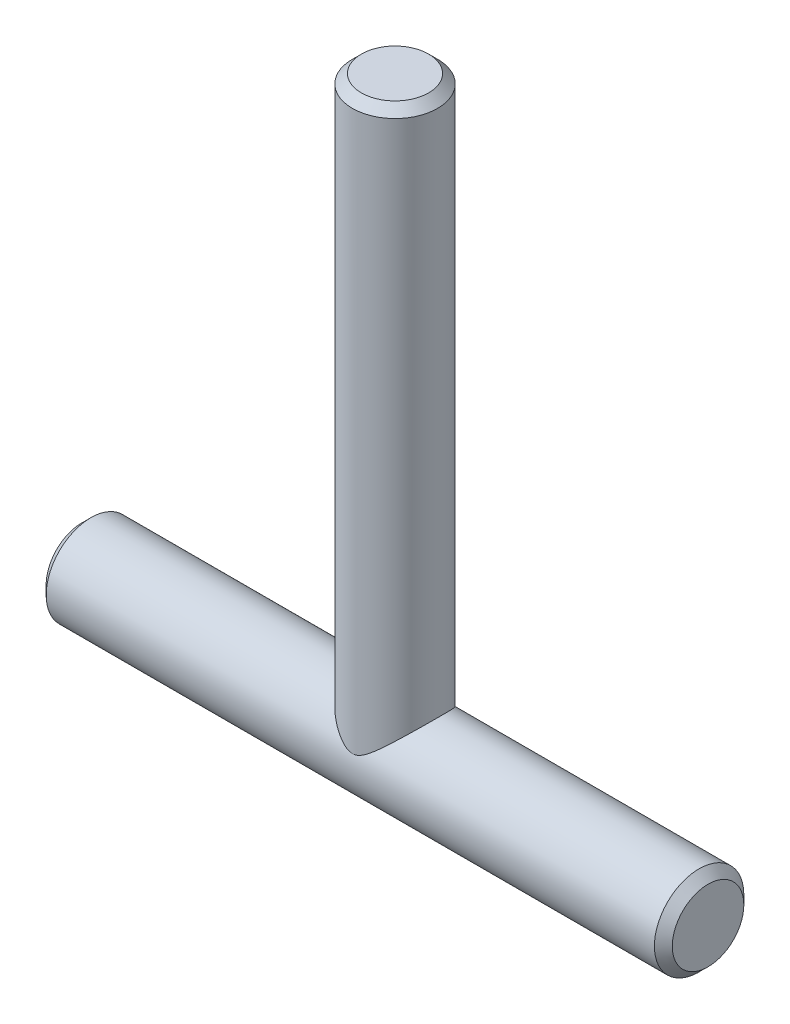
ISO-10303-21;
HEADER;
FILE_DESCRIPTION(('STEP AP214'),'2;1');
FILE_NAME('part.step','',(''),(''),'','','');
FILE_SCHEMA(('AUTOMOTIVE_DESIGN { 1 0 10303 214 1 1 1 1 }'));
ENDSEC;
DATA;
#1=APPLICATION_CONTEXT('core data for automotive mechanical design processes');
#2=APPLICATION_PROTOCOL_DEFINITION('international standard','automotive_design',2000,#1);
#3=PRODUCT_CONTEXT('',#1,'mechanical');
#4=PRODUCT('Part','Part','',(#3));
#5=PRODUCT_RELATED_PRODUCT_CATEGORY('part','',(#4));
#6=PRODUCT_DEFINITION_FORMATION('','',#4);
#7=PRODUCT_DEFINITION_CONTEXT('part definition',#1,'design');
#8=PRODUCT_DEFINITION('design','',#6,#7);
#9=PRODUCT_DEFINITION_SHAPE('','',#8);
#10=(LENGTH_UNIT() NAMED_UNIT(*) SI_UNIT(.MILLI.,.METRE.));
#11=(NAMED_UNIT(*) PLANE_ANGLE_UNIT() SI_UNIT($,.RADIAN.));
#12=(NAMED_UNIT(*) SI_UNIT($,.STERADIAN.) SOLID_ANGLE_UNIT());
#13=UNCERTAINTY_MEASURE_WITH_UNIT(LENGTH_MEASURE(1.E-05),#10,'distance_accuracy_value','');
#14=(GEOMETRIC_REPRESENTATION_CONTEXT(3) GLOBAL_UNCERTAINTY_ASSIGNED_CONTEXT((#13)) GLOBAL_UNIT_ASSIGNED_CONTEXT((#10,
#11,#12)) REPRESENTATION_CONTEXT('',''));
#15=CARTESIAN_POINT('',(0.,0.,0.));
#16=DIRECTION('',(0.,0.,1.));
#17=DIRECTION('',(1.,0.,0.));
#18=AXIS2_PLACEMENT_3D('',#15,#16,#17);
#19=CARTESIAN_POINT('',(35.,-5.,0.));
#20=DIRECTION('',(-1.,0.,0.));
#21=DIRECTION('',(0.,0.,1.));
#22=AXIS2_PLACEMENT_3D('',#19,#20,#21);
#23=CYLINDRICAL_SURFACE('',#22,5.);
#24=CARTESIAN_POINT('',(34.,-5.,0.));
#25=DIRECTION('',(1.,0.,0.));
#26=DIRECTION('',(0.,0.,-1.));
#27=AXIS2_PLACEMENT_3D('',#24,#25,#26);
#28=CIRCLE('',#27,5.);
#29=CARTESIAN_POINT('',(34.,-5.,-5.));
#30=VERTEX_POINT('',#29);
#31=EDGE_CURVE('E68',#30,#30,#28,.F.);
#32=ORIENTED_EDGE('',*,*,#31,.T.);
#33=EDGE_LOOP('',(#32));
#34=FACE_BOUND('',#33,.T.);
#35=CARTESIAN_POINT('',(-34.,-5.,0.));
#36=DIRECTION('',(1.,0.,0.));
#37=DIRECTION('',(0.,0.,-1.));
#38=AXIS2_PLACEMENT_3D('',#35,#36,#37);
#39=CIRCLE('',#38,5.);
#40=CARTESIAN_POINT('',(-34.,-5.,-5.));
#41=VERTEX_POINT('',#40);
#42=EDGE_CURVE('E74',#41,#41,#39,.T.);
#43=ORIENTED_EDGE('',*,*,#42,.T.);
#44=EDGE_LOOP('',(#43));
#45=FACE_BOUND('',#44,.T.);
#46=CARTESIAN_POINT('',(0.,-3.47730707297893,4.7625));
#47=CARTESIAN_POINT('',(-0.0962723355496803,-3.47726271930927,4.76249115843637));
#48=CARTESIAN_POINT('',(-0.192695930536659,-3.4679354693983,4.75953460625216));
#49=CARTESIAN_POINT('',(-0.382304249416825,-3.43287127327197,4.74809394696032));
#50=CARTESIAN_POINT('',(-0.47547324676432,-3.40706387148736,4.73958610368162));
#51=CARTESIAN_POINT('',(-0.639502705541242,-3.34990005725682,4.71994664895306));
#52=CARTESIAN_POINT('',(-0.711205209151666,-3.32056799197743,4.70963531957634));
#53=CARTESIAN_POINT('',(-0.851682658356092,-3.25642258319885,4.68626838956459));
#54=CARTESIAN_POINT('',(-0.920454970229299,-3.22160443543437,4.67321038022113));
#55=CARTESIAN_POINT('',(-1.12328700407057,-3.11126030730019,4.6302095016862));
#56=CARTESIAN_POINT('',(-1.25340485219234,-3.03002788058553,4.59649833090679));
#57=CARTESIAN_POINT('',(-1.52778509316713,-2.84575625192604,4.51344814983352));
#58=CARTESIAN_POINT('',(-1.67058833257177,-2.74137811152718,4.46241294947431));
#59=CARTESIAN_POINT('',(-1.94845826940471,-2.52873039907888,4.3482695784667));
#60=CARTESIAN_POINT('',(-2.08351667436905,-2.42045685077803,4.28514877011375));
#61=CARTESIAN_POINT('',(-2.34682713565849,-2.20345523501308,4.14679517724));
#62=CARTESIAN_POINT('',(-2.47508067813763,-2.09472727243345,4.07156505194197));
#63=CARTESIAN_POINT('',(-2.72497011788415,-1.87908792670338,3.90872922466407));
#64=CARTESIAN_POINT('',(-2.84660962135745,-1.77217557593641,3.82113036219946));
#65=CARTESIAN_POINT('',(-3.06504414036496,-1.57786550552856,3.64737038359203));
#66=CARTESIAN_POINT('',(-3.16281196970018,-1.4899643680945,3.56300042122222));
#67=CARTESIAN_POINT('',(-3.3528049987324,-1.31784267833267,3.38483093281721));
#68=CARTESIAN_POINT('',(-3.44502959930579,-1.23362252412061,3.29103039042326));
#69=CARTESIAN_POINT('',(-3.71200891060286,-0.988440668357825,2.99545501377304));
#70=CARTESIAN_POINT('',(-3.87764710953624,-0.834437594498019,2.77905557672189));
#71=CARTESIAN_POINT('',(-4.13822649622636,-0.590692019950141,2.36645907894568));
#72=CARTESIAN_POINT('',(-4.24048959935291,-0.494509515522902,2.17873602590992));
#73=CARTESIAN_POINT('',(-4.37618536371528,-0.366495114626114,1.88208941045589));
#74=CARTESIAN_POINT('',(-4.41847864941575,-0.326522896118836,1.78066042754501));
#75=CARTESIAN_POINT('',(-4.49652371236508,-0.252668109392578,1.5731967401526));
#76=CARTESIAN_POINT('',(-4.53227838826118,-0.218782842870511,1.46716410245148));
#77=CARTESIAN_POINT('',(-4.59695049109972,-0.157434381077223,1.24996790413439));
#78=CARTESIAN_POINT('',(-4.62579578425164,-0.130038969742872,1.13876356355497));
#79=CARTESIAN_POINT('',(-4.67557604902061,-0.0827299110452483,0.913090970216365));
#80=CARTESIAN_POINT('',(-4.69651528887364,-0.0628122267192561,0.798624514576063));
#81=CARTESIAN_POINT('',(-4.73001604195051,-0.0309337925351837,0.567439932782764));
#82=CARTESIAN_POINT('',(-4.74258237844025,-0.0189684616817618,0.450723142893886));
#83=CARTESIAN_POINT('',(-4.75904511570714,-0.00329131131386569,0.216135136166746));
#84=CARTESIAN_POINT('',(-4.76294285861868,0.00042178587107707,0.0982641008759261));
#85=CARTESIAN_POINT('',(-4.7620465960362,-0.000431835625118962,-0.120360387663848));
#86=CARTESIAN_POINT('',(-4.75842703695826,-0.00387977075050507,-0.221126435668809));
#87=CARTESIAN_POINT('',(-4.74484494133736,-0.0168139761352274,-0.421871781278082));
#88=CARTESIAN_POINT('',(-4.73488046483467,-0.0263020931811411,-0.521850828788741));
#89=CARTESIAN_POINT('',(-4.70878764799989,-0.0511356154401469,-0.720227099462674));
#90=CARTESIAN_POINT('',(-4.69266147726038,-0.066478958968553,-0.81862486671648));
#91=CARTESIAN_POINT('',(-4.65452464502714,-0.102739617091331,-1.01324210721927));
#92=CARTESIAN_POINT('',(-4.63251162092239,-0.123659169612698,-1.10946068902647));
#93=CARTESIAN_POINT('',(-4.55881014904545,-0.193639331106815,-1.39138307010106));
#94=CARTESIAN_POINT('',(-4.4990691038369,-0.250293972874779,-1.57320267342871));
#95=CARTESIAN_POINT('',(-4.36112244481931,-0.380748279555435,-1.92288525630096));
#96=CARTESIAN_POINT('',(-4.28291122916577,-0.454553145875286,-2.09074398070463));
#97=CARTESIAN_POINT('',(-4.07035436745815,-0.654372306657071,-2.48701878518854));
#98=CARTESIAN_POINT('',(-3.92695289818185,-0.788571694358277,-2.70653659115203));
#99=CARTESIAN_POINT('',(-3.69308682113569,-1.00542366576782,-3.00981050661477));
#100=CARTESIAN_POINT('',(-3.61183176352334,-1.08045729299504,-3.10672729884337));
#101=CARTESIAN_POINT('',(-3.44377875516689,-1.23475157174198,-3.29202142441143));
#102=CARTESIAN_POINT('',(-3.35698212606406,-1.3140112146369,-3.38040078135045));
#103=CARTESIAN_POINT('',(-3.14831931006004,-1.50315147604261,-3.57721453645788));
#104=CARTESIAN_POINT('',(-3.02451104572868,-1.61433148194871,-3.6823383983111));
#105=CARTESIAN_POINT('',(-2.76903870243151,-1.84047229056134,-3.87811174281039));
#106=CARTESIAN_POINT('',(-2.63737001006359,-1.95543529544615,-3.96875260813511));
#107=CARTESIAN_POINT('',(-2.36674055298361,-2.18662158807757,-4.13584500598739));
#108=CARTESIAN_POINT('',(-2.22778921033127,-2.30284310026657,-4.2123143189703));
#109=CARTESIAN_POINT('',(-1.94201615798719,-2.53366467046927,-4.35146686277539));
#110=CARTESIAN_POINT('',(-1.79520101956297,-2.64826598419124,-4.41416138747788));
#111=CARTESIAN_POINT('',(-1.52643583978475,-2.84539770704503,-4.51297323419595));
#112=CARTESIAN_POINT('',(-1.40649388917075,-2.9292610687736,-4.55188881719534));
#113=CARTESIAN_POINT('',(-1.15880847490805,-3.08888617909294,-4.62116131607207));
#114=CARTESIAN_POINT('',(-1.03106930812621,-3.16465232766212,-4.65152289497364));
#115=CARTESIAN_POINT('',(-0.803775400294149,-3.28008711391736,-4.69516293322231));
#116=CARTESIAN_POINT('',(-0.706817276829702,-3.32384742184138,-4.71084176586117));
#117=CARTESIAN_POINT('',(-0.507136114674417,-3.39772958418356,-4.73648285987549));
#118=CARTESIAN_POINT('',(-0.404432491589559,-3.42789458129802,-4.74646323176074));
#119=CARTESIAN_POINT('',(-0.215927508547597,-3.46425006461823,-4.75833786454601));
#120=CARTESIAN_POINT('',(-0.130934559567941,-3.47406773269868,-4.7614635031911));
#121=CARTESIAN_POINT('',(0.0394629809254353,-3.47917300164311,-4.76309727250388));
#122=CARTESIAN_POINT('',(0.124867002283075,-3.47447692410943,-4.76161059000406));
#123=CARTESIAN_POINT('',(0.312525729585678,-3.4489460233095,-4.75336057178489));
#124=CARTESIAN_POINT('',(0.41425024667134,-3.42471901218264,-4.74548567651153));
#125=CARTESIAN_POINT('',(0.612540686719027,-3.36145562818992,-4.72400883229943));
#126=CARTESIAN_POINT('',(0.709079050738634,-3.3223476514514,-4.71037915732773));
#127=CARTESIAN_POINT('',(0.919903680430339,-3.22402669946273,-4.67432083817027));
#128=CARTESIAN_POINT('',(1.03271646426407,-3.16223463018434,-4.65055264758684));
#129=CARTESIAN_POINT('',(1.25198990465947,-3.03063281074919,-4.59637883397777));
#130=CARTESIAN_POINT('',(1.35843747214755,-2.96080734829289,-4.56596009505598));
#131=CARTESIAN_POINT('',(1.56681491028036,-2.8164593450299,-4.49872543033687));
#132=CARTESIAN_POINT('',(1.66871886145684,-2.74191458674993,-4.4618775500867));
#133=CARTESIAN_POINT('',(1.86828039719831,-2.59067299156274,-4.38206168911204));
#134=CARTESIAN_POINT('',(1.96594111735718,-2.51397781514818,-4.33909833147024));
#135=CARTESIAN_POINT('',(2.20657415659342,-2.32042625573454,-4.2235357141578));
#136=CARTESIAN_POINT('',(2.3472491803889,-2.2030393378387,-4.14699813067394));
#137=CARTESIAN_POINT('',(2.62109007107357,-1.96954528282493,-3.97957741242975));
#138=CARTESIAN_POINT('',(2.75425113546285,-1.85343900151293,-3.88868524088109));
#139=CARTESIAN_POINT('',(3.01217766117165,-1.62535896485696,-3.69247063300919));
#140=CARTESIAN_POINT('',(3.13697283086809,-1.51337130232683,-3.58720378749013));
#141=CARTESIAN_POINT('',(3.3776273348921,-1.29535688401647,-3.36158097627505));
#142=CARTESIAN_POINT('',(3.49349266232823,-1.18932614353572,-3.24123527545509));
#143=CARTESIAN_POINT('',(3.74925812218537,-0.953725918830168,-2.94511615115819));
#144=CARTESIAN_POINT('',(3.88546162393646,-0.827060245245045,-2.76373048326522));
#145=CARTESIAN_POINT('',(4.13495099473606,-0.593814303499254,-2.37422695699003));
#146=CARTESIAN_POINT('',(4.24826228636754,-0.487211763648607,-2.16613917700936));
#147=CARTESIAN_POINT('',(4.42864383030344,-0.316971700866812,-1.76307144559141));
#148=CARTESIAN_POINT('',(4.50031566138074,-0.249097646153196,-1.57199560556002));
#149=CARTESIAN_POINT('',(4.5897623285429,-0.164255456045662,-1.27522909160054));
#150=CARTESIAN_POINT('',(4.61657207131561,-0.138798705868385,-1.1745888140924));
#151=CARTESIAN_POINT('',(4.66374224423688,-0.093980154214502,-0.97049655027447));
#152=CARTESIAN_POINT('',(4.68410544394152,-0.0746157353800677,-0.867045792198109));
#153=CARTESIAN_POINT('',(4.71811424714348,-0.0422617762628499,-0.657385363385037));
#154=CARTESIAN_POINT('',(4.73171738437611,-0.0293125372492458,-0.551162556752947));
#155=CARTESIAN_POINT('',(4.75173921787004,-0.0102495142090844,-0.337474533211313));
#156=CARTESIAN_POINT('',(4.75816103766237,-0.00413275837907356,-0.230009877012768));
#157=CARTESIAN_POINT('',(4.763694530759,0.00113773316571754,-0.0147175937259597));
#158=CARTESIAN_POINT('',(4.76280595005397,0.000291226932946424,0.0931100458445062));
#159=CARTESIAN_POINT('',(4.75373743612038,-0.00834581970925355,0.308171624633327));
#160=CARTESIAN_POINT('',(4.74555794450079,-0.0161359395454441,0.415405599414013));
#161=CARTESIAN_POINT('',(4.72317140032417,-0.0374471034462006,0.618465184943685));
#162=CARTESIAN_POINT('',(4.70959548025867,-0.0503679613493348,0.714424504867298));
#163=CARTESIAN_POINT('',(4.67681429032094,-0.0815489734596603,0.90450620017476));
#164=CARTESIAN_POINT('',(4.65760725951408,-0.0998107978645808,0.998627991100049));
#165=CARTESIAN_POINT('',(4.59196677341015,-0.162173758161676,1.27733787885524));
#166=CARTESIAN_POINT('',(4.53749594541892,-0.213869551533442,1.45842781443034));
#167=CARTESIAN_POINT('',(4.40586622389998,-0.3384799636342,1.81907977829337));
#168=CARTESIAN_POINT('',(4.32745746542413,-0.412560296085067,1.99776887555185));
#169=CARTESIAN_POINT('',(4.15323520355582,-0.57652836554278,2.33852872901214));
#170=CARTESIAN_POINT('',(4.05741224387413,-0.666424690126432,2.50059038097474));
#171=CARTESIAN_POINT('',(3.79366180244308,-0.912575020664228,2.89357542833426));
#172=CARTESIAN_POINT('',(3.61544634216719,-1.07775839569738,3.11210959466429));
#173=CARTESIAN_POINT('',(3.32900546663726,-1.33948250170596,3.40853817619092));
#174=CARTESIAN_POINT('',(3.23013896741077,-1.42922703086027,3.50226251103905));
#175=CARTESIAN_POINT('',(3.02664284560975,-1.61220316911093,3.6795413260072));
#176=CARTESIAN_POINT('',(2.92201433588459,-1.70543410374961,3.76309775997476));
#177=CARTESIAN_POINT('',(2.70460370979376,-1.89665972718761,3.92239558828248));
#178=CARTESIAN_POINT('',(2.59167796245555,-1.99471509721829,3.9978662509662));
#179=CARTESIAN_POINT('',(2.36035447257139,-2.19176615579074,4.13865633367876));
#180=CARTESIAN_POINT('',(2.24195460736618,-2.29076219706613,4.20397177232563));
#181=CARTESIAN_POINT('',(1.99962746601565,-2.48761032345596,4.32448685339066));
#182=CARTESIAN_POINT('',(1.87571088238155,-2.58546419409049,4.37970508838542));
#183=CARTESIAN_POINT('',(1.62120408412374,-2.77742577600606,4.48016007291398));
#184=CARTESIAN_POINT('',(1.49061990468822,-2.87153674256477,4.52540565865085));
#185=CARTESIAN_POINT('',(1.24737328142493,-3.03327397795228,4.59763109228373));
#186=CARTESIAN_POINT('',(1.13630032967203,-3.10244874745941,4.62645392586721));
#187=CARTESIAN_POINT('',(0.906619313231244,-3.23041398491094,4.67688441964004));
#188=CARTESIAN_POINT('',(0.788020866441095,-3.28921735841436,4.69850107703224));
#189=CARTESIAN_POINT('',(0.576312264262182,-3.37390621393252,4.72834618294689));
#190=CARTESIAN_POINT('',(0.485396163998656,-3.40439847425819,4.73862959165914));
#191=CARTESIAN_POINT('',(0.299573478432723,-3.45067687147734,4.75397008186254));
#192=CARTESIAN_POINT('',(0.204686045671073,-3.46652662514301,4.75904978230323));
#193=CARTESIAN_POINT('',(0.0728693947365212,-3.47601029469425,4.7620842489171));
#194=CARTESIAN_POINT('',(0.0364455360921929,-3.47732386381774,4.76250334712485));
#195=CARTESIAN_POINT('',(0.,-3.47730707297893,4.7625));
#196=B_SPLINE_CURVE_WITH_KNOTS('',3,(#46,#47,#48,#49,#50,#51,#52,#53,#54,#55,#56,#57,#58,#59,
#60,#61,#62,#63,#64,#65,#66,#67,#68,#69,#70,#71,#72,#73,#74,#75,#76,#77,#78,#79,#80,#81,#82,#83,
#84,#85,#86,#87,#88,#89,#90,#91,#92,#93,#94,#95,#96,#97,#98,#99,#100,#101,#102,#103,#104,#105,
#106,#107,#108,#109,#110,#111,#112,#113,#114,#115,#116,#117,#118,#119,#120,#121,#122,#123,#124,
#125,#126,#127,#128,#129,#130,#131,#132,#133,#134,#135,#136,#137,#138,#139,#140,#141,#142,#143,
#144,#145,#146,#147,#148,#149,#150,#151,#152,#153,#154,#155,#156,#157,#158,#159,#160,#161,#162,
#163,#164,#165,#166,#167,#168,#169,#170,#171,#172,#173,#174,#175,#176,#177,#178,#179,#180,#181,
#182,#183,#184,#185,#186,#187,#188,#189,#190,#191,#192,#193,#194,#195),.UNSPECIFIED.,.T.,.F.,(4,
2,2,2,2,2,2,2,2,2,2,2,2,2,2,2,2,2,2,2,2,2,2,2,2,2,2,2,2,2,2,2,2,2,2,2,2,2,2,2,2,2,2,2,2,2,2,2,2,
2,2,2,2,2,2,2,2,2,2,2,2,2,2,2,2,2,2,2,2,2,2,2,2,2,4),(0.,0.288680266136024,0.578603030138291,
0.812718712437399,1.04704056551924,1.51715736551619,2.06878469872521,2.6209920405753,
3.17307828195653,3.7248604242983,4.19308315676693,4.66135640505073,5.59523357608641,
6.29564530723802,6.64608561836239,6.99637019632071,7.35016623817886,7.70377100235415,
8.05717189366991,8.41051806509217,8.71281157081039,9.01519754723559,9.3174771485838,
9.6198782484053,10.2160831392392,10.8124690866653,11.6908668834629,12.131744714944,
12.5725177888981,13.1621869343608,13.7522056343837,14.3414789753027,14.9302673559273,
15.3841806179118,15.83784595833,16.1596796125575,16.4804846578801,16.7360725036083,
16.9913730296609,17.3040926751906,17.6183364857462,18.0098562732539,18.4021552766935,
18.7964627391896,19.1904736869741,19.785464006552,20.3808304005519,20.9739563256642,
21.5666806541037,22.3433076695012,23.1190674148342,23.7613621415591,24.0826674619417,
24.4038345555994,24.726994470606,25.0500137717044,25.3730442965738,25.6960552568807,
25.9890336903429,26.2821038405537,26.8677718580867,27.4917066678781,28.1159813057225,
29.090564964416,29.5796626679106,30.0686662382653,30.5708257849694,31.0731817108803,
31.5746030939337,32.0755783936185,32.4770857890813,32.8780899921983,33.1664937646775,
33.4536385444547,33.5629233872758),.UNSPECIFIED.);
#197=CARTESIAN_POINT('',(0.,-3.47730707297893,4.7625));
#198=VERTEX_POINT('',#197);
#199=EDGE_CURVE('E82',#198,#198,#196,.T.);
#200=ORIENTED_EDGE('',*,*,#199,.T.);
#201=EDGE_LOOP('',(#200));
#202=FACE_BOUND('',#201,.T.);
#203=ADVANCED_FACE('F49',(#34,#45,#202),#23,.T.);
#204=CARTESIAN_POINT('',(35.,-5.,0.));
#205=DIRECTION('',(1.,0.,0.));
#206=DIRECTION('',(0.,0.,-1.));
#207=AXIS2_PLACEMENT_3D('',#204,#205,#206);
#208=PLANE('',#207);
#209=CARTESIAN_POINT('',(35.,-5.,0.));
#210=DIRECTION('',(1.,0.,0.));
#211=DIRECTION('',(0.,0.,-1.));
#212=AXIS2_PLACEMENT_3D('',#209,#210,#211);
#213=CIRCLE('',#212,3.99999999999999);
#214=CARTESIAN_POINT('',(35.,-5.,-3.99999999999999));
#215=VERTEX_POINT('',#214);
#216=EDGE_CURVE('E78',#215,#215,#213,.T.);
#217=ORIENTED_EDGE('',*,*,#216,.T.);
#218=EDGE_LOOP('',(#217));
#219=FACE_BOUND('',#218,.T.);
#220=ADVANCED_FACE('F100',(#219),#208,.T.);
#221=CARTESIAN_POINT('',(-35.,-5.,0.));
#222=DIRECTION('',(1.,0.,0.));
#223=DIRECTION('',(0.,0.,-1.));
#224=AXIS2_PLACEMENT_3D('',#221,#222,#223);
#225=PLANE('',#224);
#226=CARTESIAN_POINT('',(-35.,-5.,0.));
#227=DIRECTION('',(1.,0.,0.));
#228=DIRECTION('',(0.,0.,-1.));
#229=AXIS2_PLACEMENT_3D('',#226,#227,#228);
#230=CIRCLE('',#229,4.);
#231=CARTESIAN_POINT('',(-35.,-5.,-4.));
#232=VERTEX_POINT('',#231);
#233=EDGE_CURVE('E10',#232,#232,#230,.F.);
#234=ORIENTED_EDGE('',*,*,#233,.T.);
#235=EDGE_LOOP('',(#234));
#236=FACE_BOUND('',#235,.T.);
#237=ADVANCED_FACE('F99',(#236),#225,.F.);
#238=CARTESIAN_POINT('',(0.,-5.00000000000001,0.));
#239=DIRECTION('',(0.,1.,0.));
#240=DIRECTION('',(0.,0.,1.));
#241=AXIS2_PLACEMENT_3D('',#238,#239,#240);
#242=CYLINDRICAL_SURFACE('',#241,4.7625);
#243=CARTESIAN_POINT('',(0.,59.,0.));
#244=DIRECTION('',(0.,1.,0.));
#245=DIRECTION('',(0.,0.,1.));
#246=AXIS2_PLACEMENT_3D('',#243,#244,#245);
#247=CIRCLE('',#246,4.7625);
#248=CARTESIAN_POINT('',(0.,59.,4.7625));
#249=VERTEX_POINT('',#248);
#250=EDGE_CURVE('E58',#249,#249,#247,.F.);
#251=ORIENTED_EDGE('',*,*,#250,.T.);
#252=EDGE_LOOP('',(#251));
#253=FACE_BOUND('',#252,.T.);
#254=ORIENTED_EDGE('',*,*,#199,.F.);
#255=EDGE_LOOP('',(#254));
#256=FACE_BOUND('',#255,.T.);
#257=ADVANCED_FACE('F93',(#253,#256),#242,.T.);
#258=CARTESIAN_POINT('',(0.,60.,0.));
#259=DIRECTION('',(0.,1.,0.));
#260=DIRECTION('',(0.,0.,1.));
#261=AXIS2_PLACEMENT_3D('',#258,#259,#260);
#262=PLANE('',#261);
#263=CARTESIAN_POINT('',(0.,60.,0.));
#264=DIRECTION('',(0.,1.,0.));
#265=DIRECTION('',(0.,0.,1.));
#266=AXIS2_PLACEMENT_3D('',#263,#264,#265);
#267=CIRCLE('',#266,3.76250000000001);
#268=CARTESIAN_POINT('',(0.,60.,3.76250000000001));
#269=VERTEX_POINT('',#268);
#270=EDGE_CURVE('E63',#269,#269,#267,.T.);
#271=ORIENTED_EDGE('',*,*,#270,.T.);
#272=EDGE_LOOP('',(#271));
#273=FACE_BOUND('',#272,.T.);
#274=ADVANCED_FACE('F98',(#273),#262,.T.);
#275=CARTESIAN_POINT('',(35.,-5.,0.));
#276=DIRECTION('',(-1.,0.,0.));
#277=DIRECTION('',(0.,0.,1.));
#278=AXIS2_PLACEMENT_3D('',#275,#276,#277);
#279=CONICAL_SURFACE('',#278,3.99999999999999,0.785398163397439);
#280=ORIENTED_EDGE('',*,*,#31,.F.);
#281=EDGE_LOOP('',(#280));
#282=FACE_BOUND('',#281,.T.);
#283=ORIENTED_EDGE('',*,*,#216,.F.);
#284=EDGE_LOOP('',(#283));
#285=FACE_BOUND('',#284,.T.);
#286=ADVANCED_FACE('F123',(#282,#285),#279,.T.);
#287=CARTESIAN_POINT('',(0.,60.,0.));
#288=DIRECTION('',(0.,-1.,0.));
#289=DIRECTION('',(0.,0.,-1.));
#290=AXIS2_PLACEMENT_3D('',#287,#288,#289);
#291=CONICAL_SURFACE('',#290,3.7625,0.785398163397447);
#292=ORIENTED_EDGE('',*,*,#250,.F.);
#293=EDGE_LOOP('',(#292));
#294=FACE_BOUND('',#293,.T.);
#295=ORIENTED_EDGE('',*,*,#270,.F.);
#296=EDGE_LOOP('',(#295));
#297=FACE_BOUND('',#296,.T.);
#298=ADVANCED_FACE('F118',(#294,#297),#291,.T.);
#299=CARTESIAN_POINT('',(-34.,-5.,0.));
#300=DIRECTION('',(1.,0.,0.));
#301=DIRECTION('',(0.,0.,-1.));
#302=AXIS2_PLACEMENT_3D('',#299,#300,#301);
#303=CONICAL_SURFACE('',#302,5.,0.785398163397446);
#304=ORIENTED_EDGE('',*,*,#233,.F.);
#305=EDGE_LOOP('',(#304));
#306=FACE_BOUND('',#305,.T.);
#307=ORIENTED_EDGE('',*,*,#42,.F.);
#308=EDGE_LOOP('',(#307));
#309=FACE_BOUND('',#308,.T.);
#310=ADVANCED_FACE('F52',(#306,#309),#303,.T.);
#311=CLOSED_SHELL('',(#203,#220,#237,#257,#274,#286,#298,#310));
#312=MANIFOLD_SOLID_BREP('B2',#311);
#313=ADVANCED_BREP_SHAPE_REPRESENTATION('',(#18,#312),#14);
#314=SHAPE_DEFINITION_REPRESENTATION(#9,#313);
ENDSEC;
END-ISO-10303-21;
